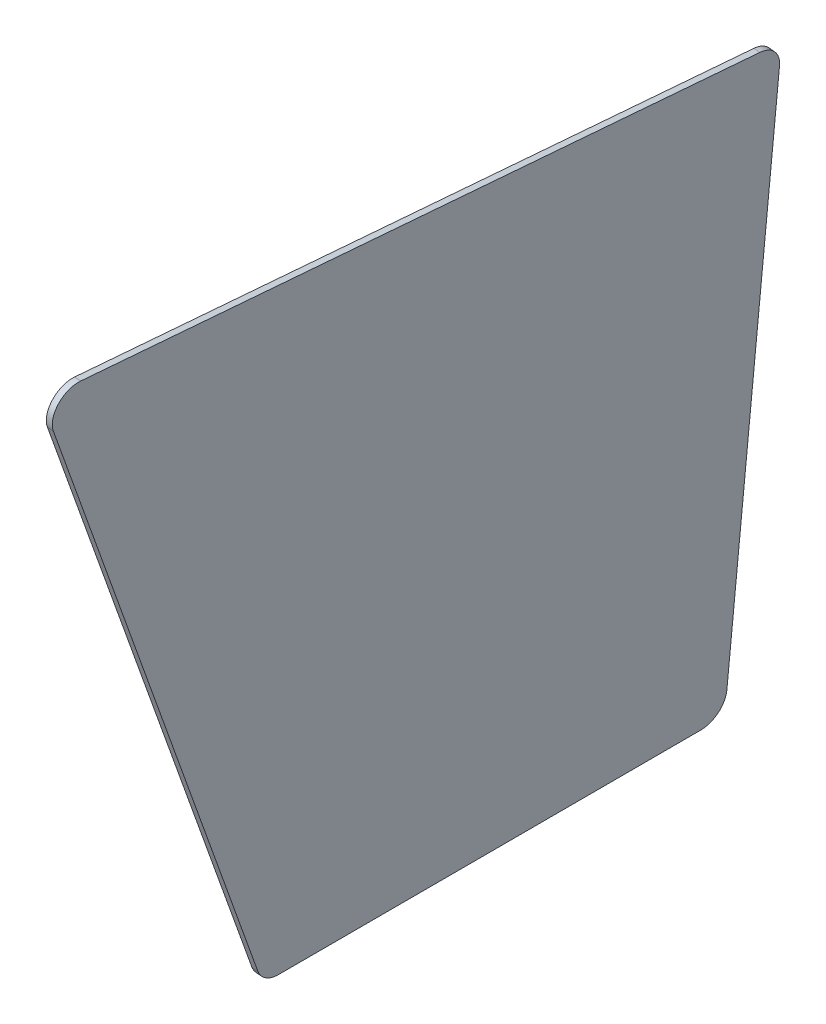
ISO-10303-21;
HEADER;
FILE_DESCRIPTION(('STEP AP214'),'2;1');
FILE_NAME('part.step','',(''),(''),'','','');
FILE_SCHEMA(('AUTOMOTIVE_DESIGN { 1 0 10303 214 1 1 1 1 }'));
ENDSEC;
DATA;
#1=APPLICATION_CONTEXT('core data for automotive mechanical design processes');
#2=APPLICATION_PROTOCOL_DEFINITION('international standard','automotive_design',2000,#1);
#3=PRODUCT_CONTEXT('',#1,'mechanical');
#4=PRODUCT('Part','Part','',(#3));
#5=PRODUCT_RELATED_PRODUCT_CATEGORY('part','',(#4));
#6=PRODUCT_DEFINITION_FORMATION('','',#4);
#7=PRODUCT_DEFINITION_CONTEXT('part definition',#1,'design');
#8=PRODUCT_DEFINITION('design','',#6,#7);
#9=PRODUCT_DEFINITION_SHAPE('','',#8);
#10=(LENGTH_UNIT() NAMED_UNIT(*) SI_UNIT(.MILLI.,.METRE.));
#11=(NAMED_UNIT(*) PLANE_ANGLE_UNIT() SI_UNIT($,.RADIAN.));
#12=(NAMED_UNIT(*) SI_UNIT($,.STERADIAN.) SOLID_ANGLE_UNIT());
#13=UNCERTAINTY_MEASURE_WITH_UNIT(LENGTH_MEASURE(1.E-05),#10,'distance_accuracy_value','');
#14=(GEOMETRIC_REPRESENTATION_CONTEXT(3) GLOBAL_UNCERTAINTY_ASSIGNED_CONTEXT((#13)) GLOBAL_UNIT_ASSIGNED_CONTEXT((#10,
#11,#12)) REPRESENTATION_CONTEXT('',''));
#15=CARTESIAN_POINT('',(0.,0.,0.));
#16=DIRECTION('',(0.,0.,1.));
#17=DIRECTION('',(1.,0.,0.));
#18=AXIS2_PLACEMENT_3D('',#15,#16,#17);
#19=CARTESIAN_POINT('',(173.751852829846,468.710075719023,-948.211534765408));
#20=DIRECTION('',(0.0355746236654687,0.382865571766707,-0.923118843977747));
#21=DIRECTION('',(0.,-0.923703527300497,-0.383108070461352));
#22=AXIS2_PLACEMENT_3D('',#19,#20,#21);
#23=PLANE('',#22);
#24=DIRECTION('',(0.0854053185316787,0.919159579003187,0.384514759005669));
#25=VECTOR('',#24,1.);
#26=CARTESIAN_POINT('',(173.751852829846,468.710075719023,-948.211534765408));
#27=LINE('',#26,#25);
#28=CARTESIAN_POINT('',(140.992484648146,116.143191314362,-1095.70188756928));
#29=VERTEX_POINT('',#28);
#30=CARTESIAN_POINT('',(171.957515725346,449.398841173957,-956.290060917799));
#31=VERTEX_POINT('',#30);
#32=EDGE_CURVE('E144',#29,#31,#27,.T.);
#33=ORIENTED_EDGE('',*,*,#32,.T.);
#34=DIRECTION('',(-0.995710991059938,0.0925182267579596,0.));
#35=VECTOR('',#34,1.);
#36=CARTESIAN_POINT('',(171.957515725346,449.398841173957,-956.290060917799));
#37=LINE('',#36,#35);
#38=CARTESIAN_POINT('',(168.796133328731,449.692586543913,-956.290060917799));
#39=VERTEX_POINT('',#38);
#40=EDGE_CURVE('E129',#39,#31,#37,.F.);
#41=ORIENTED_EDGE('',*,*,#40,.F.);
#42=DIRECTION('',(0.0854053185316787,0.919159579003187,0.384514759005669));
#43=VECTOR('',#42,1.);
#44=CARTESIAN_POINT('',(170.59047043323,469.00382108898,-948.211534765408));
#45=LINE('',#44,#43);
#46=CARTESIAN_POINT('',(137.83110225153,116.436936684319,-1095.70188756928));
#47=VERTEX_POINT('',#46);
#48=EDGE_CURVE('E111',#47,#39,#45,.T.);
#49=ORIENTED_EDGE('',*,*,#48,.F.);
#50=DIRECTION('',(-0.995710991059938,0.0925182267579596,0.));
#51=VECTOR('',#50,1.);
#52=CARTESIAN_POINT('',(140.992484648146,116.143191314362,-1095.70188756928));
#53=LINE('',#52,#51);
#54=EDGE_CURVE('E122',#29,#47,#53,.T.);
#55=ORIENTED_EDGE('',*,*,#54,.F.);
#56=EDGE_LOOP('',(#33,#41,#49,#55));
#57=FACE_BOUND('',#56,.T.);
#58=ADVANCED_FACE('F41',(#57),#23,.F.);
#59=CARTESIAN_POINT('',(170.495183084166,433.660745725826,-1344.0413217181));
#60=DIRECTION('',(-0.0921545574648567,-0.991797064853797,0.0885783251470098));
#61=DIRECTION('',(0.995710991059938,-0.0925182267579596,0.));
#62=AXIS2_PLACEMENT_3D('',#59,#60,#61);
#63=PLANE('',#62);
#64=DIRECTION('',(-0.00819510957179128,-0.0881984119185585,-0.996069214620224));
#65=VECTOR('',#64,1.);
#66=CARTESIAN_POINT('',(170.495183084166,433.660745725826,-1344.0413217181));
#67=LINE('',#66,#65);
#68=CARTESIAN_POINT('',(173.579676325701,466.857056659037,-969.138614965683));
#69=VERTEX_POINT('',#68);
#70=CARTESIAN_POINT('',(170.59041627163,434.6856759995,-1332.46626644747));
#71=VERTEX_POINT('',#70);
#72=EDGE_CURVE('E168',#69,#71,#67,.T.);
#73=ORIENTED_EDGE('',*,*,#72,.T.);
#74=DIRECTION('',(-0.995710991059938,0.0925182267579596,0.));
#75=VECTOR('',#74,1.);
#76=CARTESIAN_POINT('',(170.59041627163,434.6856759995,-1332.46626644747));
#77=LINE('',#76,#75);
#78=CARTESIAN_POINT('',(167.429033875014,434.979421369457,-1332.46626644747));
#79=VERTEX_POINT('',#78);
#80=EDGE_CURVE('E49',#79,#71,#77,.F.);
#81=ORIENTED_EDGE('',*,*,#80,.F.);
#82=DIRECTION('',(-0.00819510957179128,-0.0881984119185585,-0.996069214620224));
#83=VECTOR('',#82,1.);
#84=CARTESIAN_POINT('',(167.333800687551,433.954491095782,-1344.0413217181));
#85=LINE('',#84,#83);
#86=CARTESIAN_POINT('',(170.418293929086,467.150802028994,-969.138614965683));
#87=VERTEX_POINT('',#86);
#88=EDGE_CURVE('E132',#87,#79,#85,.T.);
#89=ORIENTED_EDGE('',*,*,#88,.F.);
#90=DIRECTION('',(-0.995710991059937,0.0925182267579596,0.));
#91=VECTOR('',#90,1.);
#92=CARTESIAN_POINT('',(173.579676325701,466.857056659037,-969.138614965683));
#93=LINE('',#92,#91);
#94=EDGE_CURVE('E11',#69,#87,#93,.T.);
#95=ORIENTED_EDGE('',*,*,#94,.F.);
#96=EDGE_LOOP('',(#73,#81,#89,#95));
#97=FACE_BOUND('',#96,.T.);
#98=ADVANCED_FACE('F169',(#97),#63,.F.);
#99=CARTESIAN_POINT('',(140.305645528048,108.751207216351,-1344.0413217181));
#100=DIRECTION('',(0.,0.,1.));
#101=DIRECTION('',(-1.,0.,0.));
#102=AXIS2_PLACEMENT_3D('',#99,#100,#101);
#103=PLANE('',#102);
#104=DIRECTION('',(-0.0925182267579596,-0.995710991059937,0.));
#105=VECTOR('',#104,1.);
#106=CARTESIAN_POINT('',(137.144263131433,109.044952586308,-1344.0413217181));
#107=LINE('',#106,#105);
#108=CARTESIAN_POINT('',(166.258670995211,422.383598645814,-1344.0413217181));
#109=VERTEX_POINT('',#108);
#110=CARTESIAN_POINT('',(138.317295399753,121.669504129968,-1344.0413217181));
#111=VERTEX_POINT('',#110);
#112=EDGE_CURVE('E135',#109,#111,#107,.T.);
#113=ORIENTED_EDGE('',*,*,#112,.F.);
#114=DIRECTION('',(-0.995710991059937,0.0925182267579596,0.));
#115=VECTOR('',#114,1.);
#116=CARTESIAN_POINT('',(169.420053391826,422.089853275857,-1344.0413217181));
#117=LINE('',#116,#115);
#118=CARTESIAN_POINT('',(169.420053391826,422.089853275857,-1344.0413217181));
#119=VERTEX_POINT('',#118);
#120=EDGE_CURVE('E159',#119,#109,#117,.T.);
#121=ORIENTED_EDGE('',*,*,#120,.F.);
#122=DIRECTION('',(-0.0925182267579596,-0.995710991059937,0.));
#123=VECTOR('',#122,1.);
#124=CARTESIAN_POINT('',(140.305645528048,108.751207216351,-1344.0413217181));
#125=LINE('',#124,#123);
#126=CARTESIAN_POINT('',(141.478677796368,121.375758760011,-1344.0413217181));
#127=VERTEX_POINT('',#126);
#128=EDGE_CURVE('E170',#119,#127,#125,.T.);
#129=ORIENTED_EDGE('',*,*,#128,.T.);
#130=DIRECTION('',(-0.995710991059938,0.0925182267579596,0.));
#131=VECTOR('',#130,1.);
#132=CARTESIAN_POINT('',(141.478677796368,121.375758760011,-1344.0413217181));
#133=LINE('',#132,#131);
#134=EDGE_CURVE('E161',#111,#127,#133,.F.);
#135=ORIENTED_EDGE('',*,*,#134,.F.);
#136=EDGE_LOOP('',(#113,#121,#129,#135));
#137=FACE_BOUND('',#136,.T.);
#138=ADVANCED_FACE('F181',(#137),#103,.F.);
#139=CARTESIAN_POINT('',(140.267999461838,108.346048111933,-1098.96368966317));
#140=DIRECTION('',(0.0925180992393236,0.995709618663256,0.00166030557924145));
#141=DIRECTION('',(-0.995710991059937,0.0925182267579596,0.));
#142=AXIS2_PLACEMENT_3D('',#139,#140,#141);
#143=PLANE('',#142);
#144=DIRECTION('',(-0.000153608528067779,-0.00165318451376885,0.999998621691742));
#145=VECTOR('',#144,1.);
#146=CARTESIAN_POINT('',(137.106617065223,108.639793481889,-1098.96368966317));
#147=LINE('',#146,#145);
#148=CARTESIAN_POINT('',(137.142315539413,109.023991972944,-1331.36240759896));
#149=VERTEX_POINT('',#148);
#150=CARTESIAN_POINT('',(137.107920111742,108.653817288732,-1107.44658276865));
#151=VERTEX_POINT('',#150);
#152=EDGE_CURVE('E114',#149,#151,#147,.T.);
#153=ORIENTED_EDGE('',*,*,#152,.F.);
#154=DIRECTION('',(-0.995710991059937,0.0925182267579596,0.));
#155=VECTOR('',#154,1.);
#156=CARTESIAN_POINT('',(140.303697936029,108.730246602988,-1331.36240759896));
#157=LINE('',#156,#155);
#158=CARTESIAN_POINT('',(140.303697936029,108.730246602988,-1331.36240759896));
#159=VERTEX_POINT('',#158);
#160=EDGE_CURVE('E118',#159,#149,#157,.T.);
#161=ORIENTED_EDGE('',*,*,#160,.F.);
#162=DIRECTION('',(-0.000153608528067779,-0.00165318451376885,0.999998621691742));
#163=VECTOR('',#162,1.);
#164=CARTESIAN_POINT('',(140.267999461838,108.346048111933,-1098.96368966317));
#165=LINE('',#164,#163);
#166=CARTESIAN_POINT('',(140.269302508358,108.360071918776,-1107.44658276865));
#167=VERTEX_POINT('',#166);
#168=EDGE_CURVE('E138',#159,#167,#165,.T.);
#169=ORIENTED_EDGE('',*,*,#168,.T.);
#170=DIRECTION('',(-0.995710991059937,0.0925182267579596,0.));
#171=VECTOR('',#170,1.);
#172=CARTESIAN_POINT('',(140.269302508358,108.360071918776,-1107.44658276865));
#173=LINE('',#172,#171);
#174=EDGE_CURVE('E152',#151,#167,#173,.F.);
#175=ORIENTED_EDGE('',*,*,#174,.F.);
#176=EDGE_LOOP('',(#153,#161,#169,#175));
#177=FACE_BOUND('',#176,.T.);
#178=ADVANCED_FACE('F187',(#177),#143,.F.);
#179=CARTESIAN_POINT('',(129.086367078636,-11.9942853779582,0.));
#180=DIRECTION('',(-0.995710991059937,0.0925182267579596,0.));
#181=DIRECTION('',(-0.0925182267579596,-0.995710991059938,0.));
#182=AXIS2_PLACEMENT_3D('',#179,#180,#181);
#183=PLANE('',#182);
#184=ORIENTED_EDGE('',*,*,#168,.F.);
#185=CARTESIAN_POINT('',(141.478677796368,121.375758760011,-1331.3413217181));
#186=DIRECTION('',(0.995710991059937,-0.0925182267579596,0.));
#187=DIRECTION('',(-0.0925182267579596,-0.995710991059938,0.));
#188=AXIS2_PLACEMENT_3D('',#185,#186,#187);
#189=CIRCLE('',#188,12.7);
#190=EDGE_CURVE('E56',#127,#159,#189,.F.);
#191=ORIENTED_EDGE('',*,*,#190,.F.);
#192=ORIENTED_EDGE('',*,*,#128,.F.);
#193=CARTESIAN_POINT('',(169.420053391826,422.089853275857,-1331.3413217181));
#194=DIRECTION('',(0.995710991059937,-0.0925182267579596,0.));
#195=DIRECTION('',(-0.0925182267579596,-0.995710991059938,0.));
#196=AXIS2_PLACEMENT_3D('',#193,#194,#195);
#197=CIRCLE('',#196,12.7);
#198=EDGE_CURVE('E64',#71,#119,#197,.F.);
#199=ORIENTED_EDGE('',*,*,#198,.F.);
#200=ORIENTED_EDGE('',*,*,#72,.F.);
#201=CARTESIAN_POINT('',(172.409313445898,454.261233935394,-968.013670236316));
#202=DIRECTION('',(0.995710991059937,-0.0925182267579596,0.));
#203=DIRECTION('',(-0.0925182267579596,-0.995710991059938,0.));
#204=AXIS2_PLACEMENT_3D('',#201,#202,#203);
#205=CIRCLE('',#204,12.7);
#206=EDGE_CURVE('E155',#31,#69,#205,.F.);
#207=ORIENTED_EDGE('',*,*,#206,.F.);
#208=ORIENTED_EDGE('',*,*,#32,.F.);
#209=CARTESIAN_POINT('',(141.444282368697,121.005584075799,-1107.4254968878));
#210=DIRECTION('',(0.995710991059937,-0.0925182267579596,0.));
#211=DIRECTION('',(-0.0925182267579596,-0.995710991059938,0.));
#212=AXIS2_PLACEMENT_3D('',#209,#210,#211);
#213=CIRCLE('',#212,12.7);
#214=EDGE_CURVE('E124',#167,#29,#213,.F.);
#215=ORIENTED_EDGE('',*,*,#214,.F.);
#216=EDGE_LOOP('',(#184,#191,#192,#199,#200,#207,#208,#215));
#217=FACE_BOUND('',#216,.T.);
#218=ADVANCED_FACE('F174',(#217),#183,.F.);
#219=CARTESIAN_POINT('',(125.92498468202,-11.7005400080016,0.));
#220=DIRECTION('',(-0.995710991059937,0.0925182267579596,0.));
#221=DIRECTION('',(-0.0925182267579596,-0.995710991059938,0.));
#222=AXIS2_PLACEMENT_3D('',#219,#220,#221);
#223=PLANE('',#222);
#224=ORIENTED_EDGE('',*,*,#48,.T.);
#225=CARTESIAN_POINT('',(169.247931049282,454.55497930535,-968.013670236316));
#226=DIRECTION('',(0.995710991059937,-0.0925182267579596,0.));
#227=DIRECTION('',(-0.0925182267579596,-0.995710991059938,0.));
#228=AXIS2_PLACEMENT_3D('',#225,#226,#227);
#229=CIRCLE('',#228,12.7);
#230=EDGE_CURVE('E147',#87,#39,#229,.T.);
#231=ORIENTED_EDGE('',*,*,#230,.F.);
#232=ORIENTED_EDGE('',*,*,#88,.T.);
#233=CARTESIAN_POINT('',(166.258670995211,422.383598645814,-1331.3413217181));
#234=DIRECTION('',(0.995710991059937,-0.0925182267579596,0.));
#235=DIRECTION('',(-0.0925182267579596,-0.995710991059938,0.));
#236=AXIS2_PLACEMENT_3D('',#233,#234,#235);
#237=CIRCLE('',#236,12.7);
#238=EDGE_CURVE('E128',#109,#79,#237,.T.);
#239=ORIENTED_EDGE('',*,*,#238,.F.);
#240=ORIENTED_EDGE('',*,*,#112,.T.);
#241=CARTESIAN_POINT('',(138.317295399753,121.669504129968,-1331.3413217181));
#242=DIRECTION('',(0.995710991059937,-0.0925182267579596,0.));
#243=DIRECTION('',(-0.0925182267579596,-0.995710991059938,0.));
#244=AXIS2_PLACEMENT_3D('',#241,#242,#243);
#245=CIRCLE('',#244,12.7);
#246=EDGE_CURVE('E119',#149,#111,#245,.T.);
#247=ORIENTED_EDGE('',*,*,#246,.F.);
#248=ORIENTED_EDGE('',*,*,#152,.T.);
#249=CARTESIAN_POINT('',(138.282899972082,121.299329445756,-1107.4254968878));
#250=DIRECTION('',(0.995710991059937,-0.0925182267579596,0.));
#251=DIRECTION('',(-0.0925182267579596,-0.995710991059938,0.));
#252=AXIS2_PLACEMENT_3D('',#249,#250,#251);
#253=CIRCLE('',#252,12.7);
#254=EDGE_CURVE('E107',#47,#151,#253,.T.);
#255=ORIENTED_EDGE('',*,*,#254,.F.);
#256=EDGE_LOOP('',(#224,#231,#232,#239,#240,#247,#248,#255));
#257=FACE_BOUND('',#256,.T.);
#258=ADVANCED_FACE('F109',(#257),#223,.T.);
#259=CARTESIAN_POINT('',(141.444282368697,121.005584075799,-1107.4254968878));
#260=DIRECTION('',(-0.995710991059937,0.0925182267579596,0.));
#261=DIRECTION('',(-0.0925182267579596,-0.995710991059938,0.));
#262=AXIS2_PLACEMENT_3D('',#259,#260,#261);
#263=CYLINDRICAL_SURFACE('',#262,12.7);
#264=ORIENTED_EDGE('',*,*,#214,.T.);
#265=ORIENTED_EDGE('',*,*,#54,.T.);
#266=ORIENTED_EDGE('',*,*,#254,.T.);
#267=ORIENTED_EDGE('',*,*,#174,.T.);
#268=EDGE_LOOP('',(#264,#265,#266,#267));
#269=FACE_BOUND('',#268,.T.);
#270=ADVANCED_FACE('F123',(#269),#263,.T.);
#271=CARTESIAN_POINT('',(141.478677796368,121.375758760011,-1331.3413217181));
#272=DIRECTION('',(-0.995710991059938,0.0925182267579596,0.));
#273=DIRECTION('',(-0.0925182267579596,-0.995710991059938,0.));
#274=AXIS2_PLACEMENT_3D('',#271,#272,#273);
#275=CYLINDRICAL_SURFACE('',#274,12.7);
#276=ORIENTED_EDGE('',*,*,#190,.T.);
#277=ORIENTED_EDGE('',*,*,#160,.T.);
#278=ORIENTED_EDGE('',*,*,#246,.T.);
#279=ORIENTED_EDGE('',*,*,#134,.T.);
#280=EDGE_LOOP('',(#276,#277,#278,#279));
#281=FACE_BOUND('',#280,.T.);
#282=ADVANCED_FACE('F183',(#281),#275,.T.);
#283=CARTESIAN_POINT('',(172.409313445898,454.261233935394,-968.013670236316));
#284=DIRECTION('',(-0.995710991059938,0.0925182267579596,0.));
#285=DIRECTION('',(-0.0925182267579596,-0.995710991059938,0.));
#286=AXIS2_PLACEMENT_3D('',#283,#284,#285);
#287=CYLINDRICAL_SURFACE('',#286,12.7);
#288=ORIENTED_EDGE('',*,*,#206,.T.);
#289=ORIENTED_EDGE('',*,*,#94,.T.);
#290=ORIENTED_EDGE('',*,*,#230,.T.);
#291=ORIENTED_EDGE('',*,*,#40,.T.);
#292=EDGE_LOOP('',(#288,#289,#290,#291));
#293=FACE_BOUND('',#292,.T.);
#294=ADVANCED_FACE('F176',(#293),#287,.T.);
#295=CARTESIAN_POINT('',(169.420053391826,422.089853275857,-1331.3413217181));
#296=DIRECTION('',(-0.995710991059937,0.0925182267579596,0.));
#297=DIRECTION('',(-0.0925182267579596,-0.995710991059937,0.));
#298=AXIS2_PLACEMENT_3D('',#295,#296,#297);
#299=CYLINDRICAL_SURFACE('',#298,12.7);
#300=ORIENTED_EDGE('',*,*,#198,.T.);
#301=ORIENTED_EDGE('',*,*,#120,.T.);
#302=ORIENTED_EDGE('',*,*,#238,.T.);
#303=ORIENTED_EDGE('',*,*,#80,.T.);
#304=EDGE_LOOP('',(#300,#301,#302,#303));
#305=FACE_BOUND('',#304,.T.);
#306=ADVANCED_FACE('F43',(#305),#299,.T.);
#307=CLOSED_SHELL('',(#58,#98,#138,#178,#218,#258,#270,#282,#294,#306));
#308=MANIFOLD_SOLID_BREP('B2',#307);
#309=ADVANCED_BREP_SHAPE_REPRESENTATION('',(#18,#308),#14);
#310=SHAPE_DEFINITION_REPRESENTATION(#9,#309);
ENDSEC;
END-ISO-10303-21;
